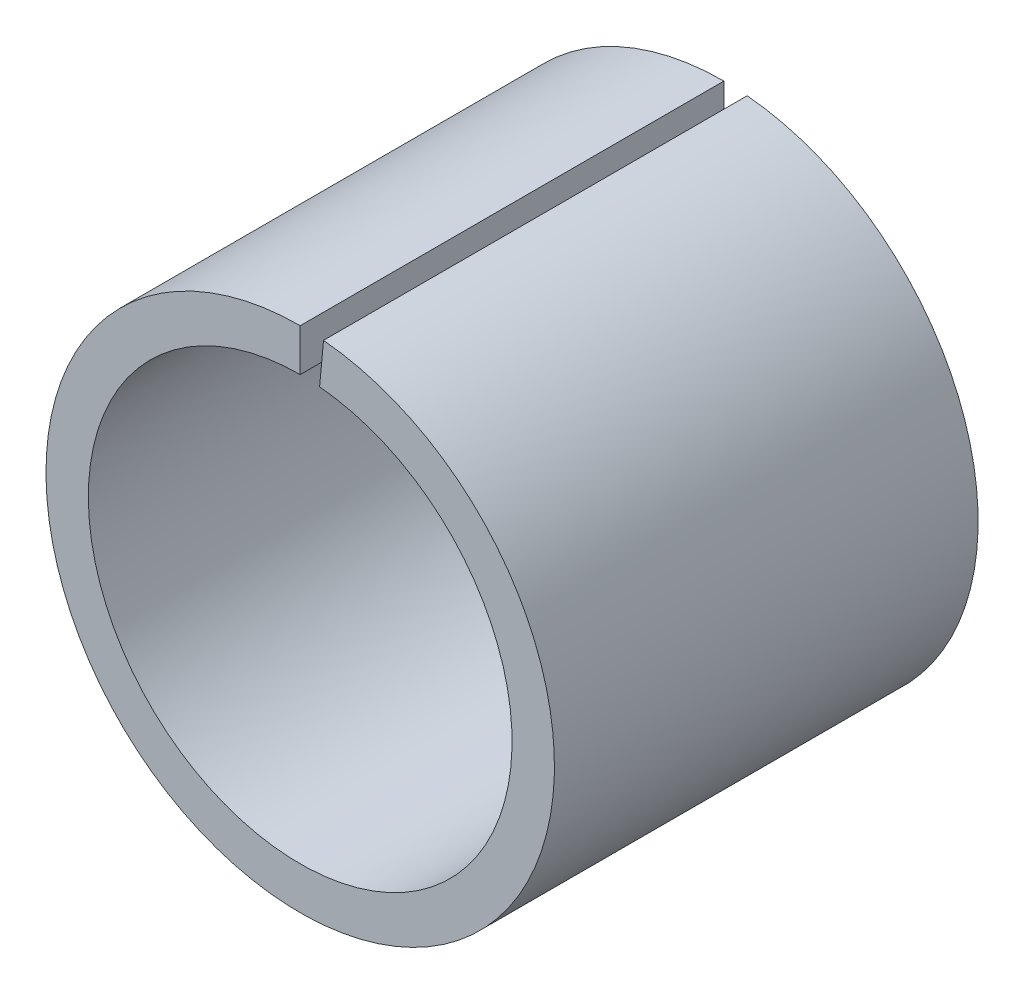
ISO-10303-21;
HEADER;
FILE_DESCRIPTION(('STEP AP214'),'2;1');
FILE_NAME('part.step','',(''),(''),'','','');
FILE_SCHEMA(('AUTOMOTIVE_DESIGN { 1 0 10303 214 1 1 1 1 }'));
ENDSEC;
DATA;
#1=APPLICATION_CONTEXT('core data for automotive mechanical design processes');
#2=APPLICATION_PROTOCOL_DEFINITION('international standard','automotive_design',2000,#1);
#3=PRODUCT_CONTEXT('',#1,'mechanical');
#4=PRODUCT('Part','Part','',(#3));
#5=PRODUCT_RELATED_PRODUCT_CATEGORY('part','',(#4));
#6=PRODUCT_DEFINITION_FORMATION('','',#4);
#7=PRODUCT_DEFINITION_CONTEXT('part definition',#1,'design');
#8=PRODUCT_DEFINITION('design','',#6,#7);
#9=PRODUCT_DEFINITION_SHAPE('','',#8);
#10=(LENGTH_UNIT() NAMED_UNIT(*) SI_UNIT(.MILLI.,.METRE.));
#11=(NAMED_UNIT(*) PLANE_ANGLE_UNIT() SI_UNIT($,.RADIAN.));
#12=(NAMED_UNIT(*) SI_UNIT($,.STERADIAN.) SOLID_ANGLE_UNIT());
#13=UNCERTAINTY_MEASURE_WITH_UNIT(LENGTH_MEASURE(1.E-05),#10,'distance_accuracy_value','');
#14=(GEOMETRIC_REPRESENTATION_CONTEXT(3) GLOBAL_UNCERTAINTY_ASSIGNED_CONTEXT((#13)) GLOBAL_UNIT_ASSIGNED_CONTEXT((#10,
#11,#12)) REPRESENTATION_CONTEXT('',''));
#15=CARTESIAN_POINT('',(0.,0.,0.));
#16=DIRECTION('',(0.,0.,1.));
#17=DIRECTION('',(1.,0.,0.));
#18=AXIS2_PLACEMENT_3D('',#15,#16,#17);
#19=CARTESIAN_POINT('',(0.,0.,10.));
#20=DIRECTION('',(0.,0.,1.));
#21=DIRECTION('',(1.,0.,0.));
#22=AXIS2_PLACEMENT_3D('',#19,#20,#21);
#23=PLANE('',#22);
#24=DIRECTION('',(0.0916248774869878,0.995793593986974,0.));
#25=VECTOR('',#24,1.);
#26=CARTESIAN_POINT('',(0.587596226807818,6.38608830433895,10.));
#27=LINE('',#26,#25);
#28=CARTESIAN_POINT('',(0.458124387434939,4.97896796993487,10.));
#29=VERTEX_POINT('',#28);
#30=CARTESIAN_POINT('',(0.549749264921927,5.97476156392185,10.));
#31=VERTEX_POINT('',#30);
#32=EDGE_CURVE('E95',#29,#31,#27,.T.);
#33=ORIENTED_EDGE('',*,*,#32,.F.);
#34=CARTESIAN_POINT('',(0.,0.,10.));
#35=DIRECTION('',(0.,0.,1.));
#36=DIRECTION('',(1.,0.,0.));
#37=AXIS2_PLACEMENT_3D('',#34,#35,#36);
#38=CIRCLE('',#37,5.);
#39=CARTESIAN_POINT('',(0.,5.,10.));
#40=VERTEX_POINT('',#39);
#41=EDGE_CURVE('E93',#40,#29,#38,.T.);
#42=ORIENTED_EDGE('',*,*,#41,.F.);
#43=DIRECTION('',(0.,-1.,0.));
#44=VECTOR('',#43,1.);
#45=CARTESIAN_POINT('',(0.,0.,10.));
#46=LINE('',#45,#44);
#47=CARTESIAN_POINT('',(0.,6.,10.));
#48=VERTEX_POINT('',#47);
#49=EDGE_CURVE('E61',#48,#40,#46,.T.);
#50=ORIENTED_EDGE('',*,*,#49,.F.);
#51=CARTESIAN_POINT('',(0.,0.,10.));
#52=DIRECTION('',(0.,0.,1.));
#53=DIRECTION('',(1.,0.,0.));
#54=AXIS2_PLACEMENT_3D('',#51,#52,#53);
#55=CIRCLE('',#54,6.);
#56=EDGE_CURVE('E91',#48,#31,#55,.T.);
#57=ORIENTED_EDGE('',*,*,#56,.T.);
#58=EDGE_LOOP('',(#33,#42,#50,#57));
#59=FACE_BOUND('',#58,.T.);
#60=ADVANCED_FACE('F38',(#59),#23,.T.);
#61=CARTESIAN_POINT('',(0.,0.,0.));
#62=DIRECTION('',(0.,0.,1.));
#63=DIRECTION('',(1.,0.,0.));
#64=AXIS2_PLACEMENT_3D('',#61,#62,#63);
#65=PLANE('',#64);
#66=CARTESIAN_POINT('',(0.,0.,0.));
#67=DIRECTION('',(0.,0.,1.));
#68=DIRECTION('',(1.,0.,0.));
#69=AXIS2_PLACEMENT_3D('',#66,#67,#68);
#70=CIRCLE('',#69,5.);
#71=CARTESIAN_POINT('',(0.,5.,0.));
#72=VERTEX_POINT('',#71);
#73=CARTESIAN_POINT('',(0.458124387434939,4.97896796993487,0.));
#74=VERTEX_POINT('',#73);
#75=EDGE_CURVE('E106',#72,#74,#70,.T.);
#76=ORIENTED_EDGE('',*,*,#75,.T.);
#77=DIRECTION('',(0.0916248774869878,0.995793593986974,0.));
#78=VECTOR('',#77,1.);
#79=CARTESIAN_POINT('',(0.,0.,0.));
#80=LINE('',#79,#78);
#81=CARTESIAN_POINT('',(0.549749264921927,5.97476156392185,0.));
#82=VERTEX_POINT('',#81);
#83=EDGE_CURVE('E53',#74,#82,#80,.T.);
#84=ORIENTED_EDGE('',*,*,#83,.T.);
#85=CARTESIAN_POINT('',(0.,0.,0.));
#86=DIRECTION('',(0.,0.,1.));
#87=DIRECTION('',(1.,0.,0.));
#88=AXIS2_PLACEMENT_3D('',#85,#86,#87);
#89=CIRCLE('',#88,6.);
#90=CARTESIAN_POINT('',(0.,6.,0.));
#91=VERTEX_POINT('',#90);
#92=EDGE_CURVE('E100',#91,#82,#89,.T.);
#93=ORIENTED_EDGE('',*,*,#92,.F.);
#94=DIRECTION('',(0.,-1.,0.));
#95=VECTOR('',#94,1.);
#96=CARTESIAN_POINT('',(0.,0.,0.));
#97=LINE('',#96,#95);
#98=EDGE_CURVE('E80',#91,#72,#97,.T.);
#99=ORIENTED_EDGE('',*,*,#98,.T.);
#100=EDGE_LOOP('',(#76,#84,#93,#99));
#101=FACE_BOUND('',#100,.T.);
#102=ADVANCED_FACE('F124',(#101),#65,.F.);
#103=CARTESIAN_POINT('',(0.,0.,10.));
#104=DIRECTION('',(0.,0.,-1.));
#105=DIRECTION('',(-1.,0.,0.));
#106=AXIS2_PLACEMENT_3D('',#103,#104,#105);
#107=CYLINDRICAL_SURFACE('',#106,6.);
#108=ORIENTED_EDGE('',*,*,#92,.T.);
#109=DIRECTION('',(0.,0.,-1.));
#110=VECTOR('',#109,1.);
#111=CARTESIAN_POINT('',(0.549749264921927,5.97476156392185,10.));
#112=LINE('',#111,#110);
#113=EDGE_CURVE('E98',#82,#31,#112,.F.);
#114=ORIENTED_EDGE('',*,*,#113,.T.);
#115=ORIENTED_EDGE('',*,*,#56,.F.);
#116=DIRECTION('',(0.,0.,1.));
#117=VECTOR('',#116,1.);
#118=CARTESIAN_POINT('',(0.,6.,-10.));
#119=LINE('',#118,#117);
#120=EDGE_CURVE('E77',#91,#48,#119,.T.);
#121=ORIENTED_EDGE('',*,*,#120,.F.);
#122=EDGE_LOOP('',(#108,#114,#115,#121));
#123=FACE_BOUND('',#122,.T.);
#124=ADVANCED_FACE('F40',(#123),#107,.T.);
#125=CARTESIAN_POINT('',(0.,0.,10.));
#126=DIRECTION('',(0.,0.,-1.));
#127=DIRECTION('',(-1.,0.,0.));
#128=AXIS2_PLACEMENT_3D('',#125,#126,#127);
#129=CYLINDRICAL_SURFACE('',#128,5.);
#130=DIRECTION('',(0.,0.,-1.));
#131=VECTOR('',#130,1.);
#132=CARTESIAN_POINT('',(0.458124387434939,4.97896796993487,10.));
#133=LINE('',#132,#131);
#134=EDGE_CURVE('E11',#74,#29,#133,.F.);
#135=ORIENTED_EDGE('',*,*,#134,.F.);
#136=ORIENTED_EDGE('',*,*,#75,.F.);
#137=DIRECTION('',(0.,0.,-1.));
#138=VECTOR('',#137,1.);
#139=CARTESIAN_POINT('',(0.,5.,10.));
#140=LINE('',#139,#138);
#141=EDGE_CURVE('E47',#40,#72,#140,.T.);
#142=ORIENTED_EDGE('',*,*,#141,.F.);
#143=ORIENTED_EDGE('',*,*,#41,.T.);
#144=EDGE_LOOP('',(#135,#136,#142,#143));
#145=FACE_BOUND('',#144,.T.);
#146=ADVANCED_FACE('F121',(#145),#129,.F.);
#147=CARTESIAN_POINT('',(0.,0.,-10.));
#148=DIRECTION('',(-1.,0.,0.));
#149=DIRECTION('',(0.,0.,1.));
#150=AXIS2_PLACEMENT_3D('',#147,#148,#149);
#151=PLANE('',#150);
#152=ORIENTED_EDGE('',*,*,#120,.T.);
#153=ORIENTED_EDGE('',*,*,#49,.T.);
#154=ORIENTED_EDGE('',*,*,#141,.T.);
#155=ORIENTED_EDGE('',*,*,#98,.F.);
#156=EDGE_LOOP('',(#152,#153,#154,#155));
#157=FACE_BOUND('',#156,.T.);
#158=ADVANCED_FACE('F78',(#157),#151,.F.);
#159=CARTESIAN_POINT('',(0.587596226807818,6.38608830433895,-10.));
#160=DIRECTION('',(0.995793593986974,-0.0916248774869878,0.));
#161=DIRECTION('',(0.0916248774869878,0.995793593986974,0.));
#162=AXIS2_PLACEMENT_3D('',#159,#160,#161);
#163=PLANE('',#162);
#164=ORIENTED_EDGE('',*,*,#83,.F.);
#165=ORIENTED_EDGE('',*,*,#134,.T.);
#166=ORIENTED_EDGE('',*,*,#32,.T.);
#167=ORIENTED_EDGE('',*,*,#113,.F.);
#168=EDGE_LOOP('',(#164,#165,#166,#167));
#169=FACE_BOUND('',#168,.T.);
#170=ADVANCED_FACE('F119',(#169),#163,.F.);
#171=CLOSED_SHELL('',(#60,#102,#124,#146,#158,#170));
#172=MANIFOLD_SOLID_BREP('B2',#171);
#173=ADVANCED_BREP_SHAPE_REPRESENTATION('',(#18,#172),#14);
#174=SHAPE_DEFINITION_REPRESENTATION(#9,#173);
ENDSEC;
END-ISO-10303-21;
